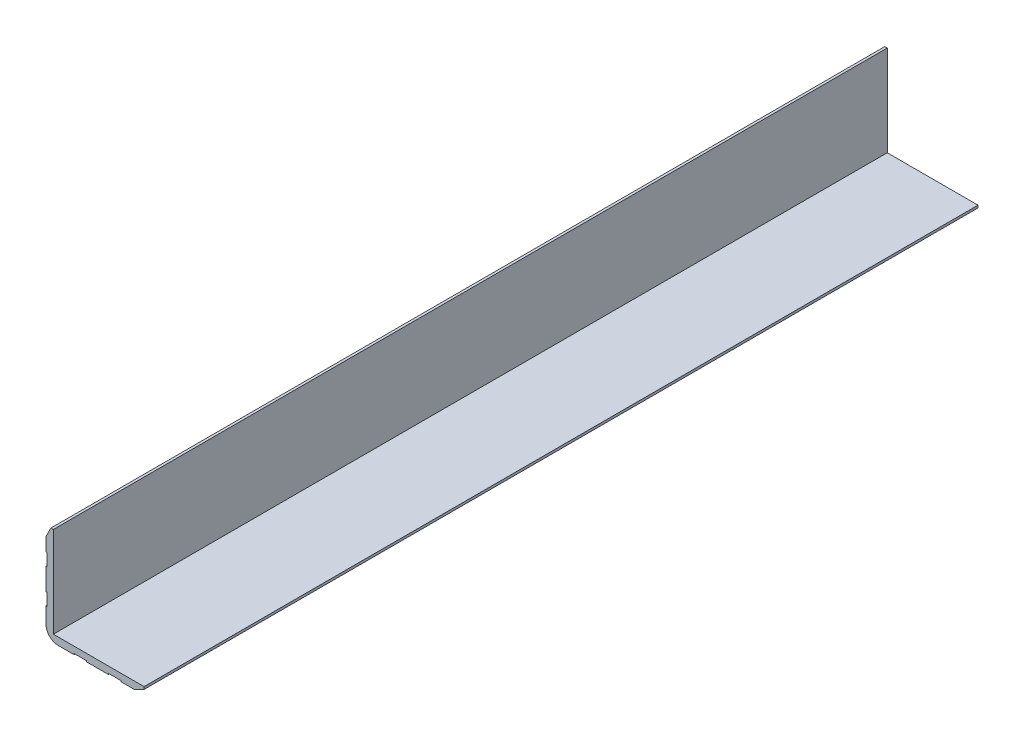
ISO-10303-21;
HEADER;
FILE_DESCRIPTION(('STEP AP214'),'2;1');
FILE_NAME('part.step','',(''),(''),'','','');
FILE_SCHEMA(('AUTOMOTIVE_DESIGN { 1 0 10303 214 1 1 1 1 }'));
ENDSEC;
DATA;
#1=APPLICATION_CONTEXT('core data for automotive mechanical design processes');
#2=APPLICATION_PROTOCOL_DEFINITION('international standard','automotive_design',2000,#1);
#3=PRODUCT_CONTEXT('',#1,'mechanical');
#4=PRODUCT('Part','Part','',(#3));
#5=PRODUCT_RELATED_PRODUCT_CATEGORY('part','',(#4));
#6=PRODUCT_DEFINITION_FORMATION('','',#4);
#7=PRODUCT_DEFINITION_CONTEXT('part definition',#1,'design');
#8=PRODUCT_DEFINITION('design','',#6,#7);
#9=PRODUCT_DEFINITION_SHAPE('','',#8);
#10=(LENGTH_UNIT() NAMED_UNIT(*) SI_UNIT(.MILLI.,.METRE.));
#11=(NAMED_UNIT(*) PLANE_ANGLE_UNIT() SI_UNIT($,.RADIAN.));
#12=(NAMED_UNIT(*) SI_UNIT($,.STERADIAN.) SOLID_ANGLE_UNIT());
#13=UNCERTAINTY_MEASURE_WITH_UNIT(LENGTH_MEASURE(1.E-05),#10,'distance_accuracy_value','');
#14=(GEOMETRIC_REPRESENTATION_CONTEXT(3) GLOBAL_UNCERTAINTY_ASSIGNED_CONTEXT((#13)) GLOBAL_UNIT_ASSIGNED_CONTEXT((#10,
#11,#12)) REPRESENTATION_CONTEXT('',''));
#15=CARTESIAN_POINT('',(0.,0.,0.));
#16=DIRECTION('',(0.,0.,1.));
#17=DIRECTION('',(1.,0.,0.));
#18=AXIS2_PLACEMENT_3D('',#15,#16,#17);
#19=CARTESIAN_POINT('',(18.5,0.,170.));
#20=DIRECTION('',(0.,-1.,0.));
#21=DIRECTION('',(1.,0.,0.));
#22=AXIS2_PLACEMENT_3D('',#19,#20,#21);
#23=PLANE('',#22);
#24=DIRECTION('',(-1.,0.,0.));
#25=VECTOR('',#24,1.);
#26=CARTESIAN_POINT('',(18.5,0.,0.));
#27=LINE('',#26,#25);
#28=CARTESIAN_POINT('',(18.5,0.,0.));
#29=VERTEX_POINT('',#28);
#30=CARTESIAN_POINT('',(0.,0.,0.));
#31=VERTEX_POINT('',#30);
#32=EDGE_CURVE('E246',#29,#31,#27,.T.);
#33=ORIENTED_EDGE('',*,*,#32,.T.);
#34=DIRECTION('',(0.,0.,-1.));
#35=VECTOR('',#34,1.);
#36=CARTESIAN_POINT('',(0.,0.,170.));
#37=LINE('',#36,#35);
#38=CARTESIAN_POINT('',(0.,0.,170.));
#39=VERTEX_POINT('',#38);
#40=EDGE_CURVE('E11',#39,#31,#37,.T.);
#41=ORIENTED_EDGE('',*,*,#40,.F.);
#42=DIRECTION('',(-1.,0.,0.));
#43=VECTOR('',#42,1.);
#44=CARTESIAN_POINT('',(18.5,0.,170.));
#45=LINE('',#44,#43);
#46=CARTESIAN_POINT('',(18.5,0.,170.));
#47=VERTEX_POINT('',#46);
#48=EDGE_CURVE('E319',#47,#39,#45,.T.);
#49=ORIENTED_EDGE('',*,*,#48,.F.);
#50=DIRECTION('',(0.,0.,-1.));
#51=VECTOR('',#50,1.);
#52=CARTESIAN_POINT('',(18.5,0.,170.));
#53=LINE('',#52,#51);
#54=EDGE_CURVE('E242',#47,#29,#53,.T.);
#55=ORIENTED_EDGE('',*,*,#54,.T.);
#56=EDGE_LOOP('',(#33,#41,#49,#55));
#57=FACE_BOUND('',#56,.T.);
#58=ADVANCED_FACE('F43',(#57),#23,.F.);
#59=CARTESIAN_POINT('',(0.,0.,170.));
#60=DIRECTION('',(-1.,0.,0.));
#61=DIRECTION('',(0.,0.,1.));
#62=AXIS2_PLACEMENT_3D('',#59,#60,#61);
#63=PLANE('',#62);
#64=DIRECTION('',(0.,1.,0.));
#65=VECTOR('',#64,1.);
#66=CARTESIAN_POINT('',(0.,0.,0.));
#67=LINE('',#66,#65);
#68=CARTESIAN_POINT('',(0.,18.5,0.));
#69=VERTEX_POINT('',#68);
#70=EDGE_CURVE('E250',#31,#69,#67,.T.);
#71=ORIENTED_EDGE('',*,*,#70,.T.);
#72=DIRECTION('',(0.,0.,-1.));
#73=VECTOR('',#72,1.);
#74=CARTESIAN_POINT('',(0.,18.5,170.));
#75=LINE('',#74,#73);
#76=CARTESIAN_POINT('',(0.,18.5,170.));
#77=VERTEX_POINT('',#76);
#78=EDGE_CURVE('E52',#77,#69,#75,.T.);
#79=ORIENTED_EDGE('',*,*,#78,.F.);
#80=DIRECTION('',(0.,1.,0.));
#81=VECTOR('',#80,1.);
#82=CARTESIAN_POINT('',(0.,0.,170.));
#83=LINE('',#82,#81);
#84=EDGE_CURVE('E154',#39,#77,#83,.T.);
#85=ORIENTED_EDGE('',*,*,#84,.F.);
#86=ORIENTED_EDGE('',*,*,#40,.T.);
#87=EDGE_LOOP('',(#71,#79,#85,#86));
#88=FACE_BOUND('',#87,.T.);
#89=ADVANCED_FACE('F504',(#88),#63,.F.);
#90=CARTESIAN_POINT('',(0.,18.5,170.));
#91=DIRECTION('',(0.,-1.,0.));
#92=DIRECTION('',(0.,0.,-1.));
#93=AXIS2_PLACEMENT_3D('',#90,#91,#92);
#94=PLANE('',#93);
#95=DIRECTION('',(-1.,0.,0.));
#96=VECTOR('',#95,1.);
#97=CARTESIAN_POINT('',(0.,18.5,0.));
#98=LINE('',#97,#96);
#99=CARTESIAN_POINT('',(-0.5,18.5,0.));
#100=VERTEX_POINT('',#99);
#101=EDGE_CURVE('E253',#69,#100,#98,.T.);
#102=ORIENTED_EDGE('',*,*,#101,.T.);
#103=DIRECTION('',(0.,0.,-1.));
#104=VECTOR('',#103,1.);
#105=CARTESIAN_POINT('',(-0.5,18.5,170.));
#106=LINE('',#105,#104);
#107=CARTESIAN_POINT('',(-0.5,18.5,170.));
#108=VERTEX_POINT('',#107);
#109=EDGE_CURVE('E398',#108,#100,#106,.T.);
#110=ORIENTED_EDGE('',*,*,#109,.F.);
#111=DIRECTION('',(-1.,0.,0.));
#112=VECTOR('',#111,1.);
#113=CARTESIAN_POINT('',(0.,18.5,170.));
#114=LINE('',#113,#112);
#115=EDGE_CURVE('E408',#77,#108,#114,.T.);
#116=ORIENTED_EDGE('',*,*,#115,.F.);
#117=ORIENTED_EDGE('',*,*,#78,.T.);
#118=EDGE_LOOP('',(#102,#110,#116,#117));
#119=FACE_BOUND('',#118,.T.);
#120=ADVANCED_FACE('F406',(#119),#94,.F.);
#121=CARTESIAN_POINT('',(-0.5,18.5,170.));
#122=DIRECTION('',(0.894427190999916,-0.447213595499958,0.));
#123=DIRECTION('',(0.447213595499958,0.894427190999916,0.));
#124=AXIS2_PLACEMENT_3D('',#121,#122,#123);
#125=PLANE('',#124);
#126=DIRECTION('',(-0.447213595499958,-0.894427190999916,0.));
#127=VECTOR('',#126,1.);
#128=CARTESIAN_POINT('',(-0.5,18.5,0.));
#129=LINE('',#128,#127);
#130=CARTESIAN_POINT('',(-1.5,16.5,0.));
#131=VERTEX_POINT('',#130);
#132=EDGE_CURVE('E256',#100,#131,#129,.T.);
#133=ORIENTED_EDGE('',*,*,#132,.T.);
#134=DIRECTION('',(0.,0.,-1.));
#135=VECTOR('',#134,1.);
#136=CARTESIAN_POINT('',(-1.5,16.5,170.));
#137=LINE('',#136,#135);
#138=CARTESIAN_POINT('',(-1.5,16.5,170.));
#139=VERTEX_POINT('',#138);
#140=EDGE_CURVE('E394',#139,#131,#137,.T.);
#141=ORIENTED_EDGE('',*,*,#140,.F.);
#142=DIRECTION('',(-0.447213595499958,-0.894427190999916,0.));
#143=VECTOR('',#142,1.);
#144=CARTESIAN_POINT('',(-0.5,18.5,170.));
#145=LINE('',#144,#143);
#146=EDGE_CURVE('E427',#108,#139,#145,.T.);
#147=ORIENTED_EDGE('',*,*,#146,.F.);
#148=ORIENTED_EDGE('',*,*,#109,.T.);
#149=EDGE_LOOP('',(#133,#141,#147,#148));
#150=FACE_BOUND('',#149,.T.);
#151=ADVANCED_FACE('F417',(#150),#125,.F.);
#152=CARTESIAN_POINT('',(-1.5,16.5,170.));
#153=DIRECTION('',(1.,0.,0.));
#154=DIRECTION('',(0.,1.,0.));
#155=AXIS2_PLACEMENT_3D('',#152,#153,#154);
#156=PLANE('',#155);
#157=DIRECTION('',(0.,-1.,0.));
#158=VECTOR('',#157,1.);
#159=CARTESIAN_POINT('',(-1.5,16.5,0.));
#160=LINE('',#159,#158);
#161=CARTESIAN_POINT('',(-1.5,13.75,0.));
#162=VERTEX_POINT('',#161);
#163=EDGE_CURVE('E259',#131,#162,#160,.T.);
#164=ORIENTED_EDGE('',*,*,#163,.T.);
#165=DIRECTION('',(0.,0.,-1.));
#166=VECTOR('',#165,1.);
#167=CARTESIAN_POINT('',(-1.5,13.75,170.));
#168=LINE('',#167,#166);
#169=CARTESIAN_POINT('',(-1.5,13.75,170.));
#170=VERTEX_POINT('',#169);
#171=EDGE_CURVE('E390',#170,#162,#168,.T.);
#172=ORIENTED_EDGE('',*,*,#171,.F.);
#173=DIRECTION('',(0.,-1.,0.));
#174=VECTOR('',#173,1.);
#175=CARTESIAN_POINT('',(-1.5,16.5,170.));
#176=LINE('',#175,#174);
#177=EDGE_CURVE('E423',#139,#170,#176,.T.);
#178=ORIENTED_EDGE('',*,*,#177,.F.);
#179=ORIENTED_EDGE('',*,*,#140,.T.);
#180=EDGE_LOOP('',(#164,#172,#178,#179));
#181=FACE_BOUND('',#180,.T.);
#182=ADVANCED_FACE('F421',(#181),#156,.F.);
#183=CARTESIAN_POINT('',(-1.5,13.75,170.));
#184=DIRECTION('',(0.,1.,0.));
#185=DIRECTION('',(0.,0.,1.));
#186=AXIS2_PLACEMENT_3D('',#183,#184,#185);
#187=PLANE('',#186);
#188=DIRECTION('',(1.,0.,0.));
#189=VECTOR('',#188,1.);
#190=CARTESIAN_POINT('',(-1.5,13.75,0.));
#191=LINE('',#190,#189);
#192=CARTESIAN_POINT('',(-1.3,13.75,0.));
#193=VERTEX_POINT('',#192);
#194=EDGE_CURVE('E262',#162,#193,#191,.T.);
#195=ORIENTED_EDGE('',*,*,#194,.T.);
#196=DIRECTION('',(0.,0.,-1.));
#197=VECTOR('',#196,1.);
#198=CARTESIAN_POINT('',(-1.3,13.75,170.));
#199=LINE('',#198,#197);
#200=CARTESIAN_POINT('',(-1.3,13.75,170.));
#201=VERTEX_POINT('',#200);
#202=EDGE_CURVE('E386',#201,#193,#199,.T.);
#203=ORIENTED_EDGE('',*,*,#202,.F.);
#204=DIRECTION('',(1.,0.,0.));
#205=VECTOR('',#204,1.);
#206=CARTESIAN_POINT('',(-1.5,13.75,170.));
#207=LINE('',#206,#205);
#208=EDGE_CURVE('E426',#170,#201,#207,.T.);
#209=ORIENTED_EDGE('',*,*,#208,.F.);
#210=ORIENTED_EDGE('',*,*,#171,.T.);
#211=EDGE_LOOP('',(#195,#203,#209,#210));
#212=FACE_BOUND('',#211,.T.);
#213=ADVANCED_FACE('F517',(#212),#187,.F.);
#214=CARTESIAN_POINT('',(-1.3,13.75,170.));
#215=DIRECTION('',(1.,0.,0.));
#216=DIRECTION('',(0.,0.,-1.));
#217=AXIS2_PLACEMENT_3D('',#214,#215,#216);
#218=PLANE('',#217);
#219=DIRECTION('',(0.,-1.,0.));
#220=VECTOR('',#219,1.);
#221=CARTESIAN_POINT('',(-1.3,13.75,0.));
#222=LINE('',#221,#220);
#223=CARTESIAN_POINT('',(-1.3,11.25,0.));
#224=VERTEX_POINT('',#223);
#225=EDGE_CURVE('E265',#193,#224,#222,.T.);
#226=ORIENTED_EDGE('',*,*,#225,.T.);
#227=DIRECTION('',(0.,0.,-1.));
#228=VECTOR('',#227,1.);
#229=CARTESIAN_POINT('',(-1.3,11.25,170.));
#230=LINE('',#229,#228);
#231=CARTESIAN_POINT('',(-1.3,11.25,170.));
#232=VERTEX_POINT('',#231);
#233=EDGE_CURVE('E382',#232,#224,#230,.T.);
#234=ORIENTED_EDGE('',*,*,#233,.F.);
#235=DIRECTION('',(0.,-1.,0.));
#236=VECTOR('',#235,1.);
#237=CARTESIAN_POINT('',(-1.3,13.75,170.));
#238=LINE('',#237,#236);
#239=EDGE_CURVE('E431',#201,#232,#238,.T.);
#240=ORIENTED_EDGE('',*,*,#239,.F.);
#241=ORIENTED_EDGE('',*,*,#202,.T.);
#242=EDGE_LOOP('',(#226,#234,#240,#241));
#243=FACE_BOUND('',#242,.T.);
#244=ADVANCED_FACE('F520',(#243),#218,.F.);
#245=CARTESIAN_POINT('',(-1.3,11.25,170.));
#246=DIRECTION('',(0.,-1.,0.));
#247=DIRECTION('',(0.,0.,-1.));
#248=AXIS2_PLACEMENT_3D('',#245,#246,#247);
#249=PLANE('',#248);
#250=DIRECTION('',(-1.,0.,0.));
#251=VECTOR('',#250,1.);
#252=CARTESIAN_POINT('',(-1.3,11.25,0.));
#253=LINE('',#252,#251);
#254=CARTESIAN_POINT('',(-1.5,11.25,0.));
#255=VERTEX_POINT('',#254);
#256=EDGE_CURVE('E268',#224,#255,#253,.T.);
#257=ORIENTED_EDGE('',*,*,#256,.T.);
#258=DIRECTION('',(0.,0.,-1.));
#259=VECTOR('',#258,1.);
#260=CARTESIAN_POINT('',(-1.5,11.25,170.));
#261=LINE('',#260,#259);
#262=CARTESIAN_POINT('',(-1.5,11.25,170.));
#263=VERTEX_POINT('',#262);
#264=EDGE_CURVE('E378',#263,#255,#261,.T.);
#265=ORIENTED_EDGE('',*,*,#264,.F.);
#266=DIRECTION('',(-1.,0.,0.));
#267=VECTOR('',#266,1.);
#268=CARTESIAN_POINT('',(-1.3,11.25,170.));
#269=LINE('',#268,#267);
#270=EDGE_CURVE('E438',#232,#263,#269,.T.);
#271=ORIENTED_EDGE('',*,*,#270,.F.);
#272=ORIENTED_EDGE('',*,*,#233,.T.);
#273=EDGE_LOOP('',(#257,#265,#271,#272));
#274=FACE_BOUND('',#273,.T.);
#275=ADVANCED_FACE('F524',(#274),#249,.F.);
#276=CARTESIAN_POINT('',(-1.5,11.25,170.));
#277=DIRECTION('',(1.,0.,0.));
#278=DIRECTION('',(0.,1.,0.));
#279=AXIS2_PLACEMENT_3D('',#276,#277,#278);
#280=PLANE('',#279);
#281=DIRECTION('',(0.,-1.,0.));
#282=VECTOR('',#281,1.);
#283=CARTESIAN_POINT('',(-1.5,11.25,0.));
#284=LINE('',#283,#282);
#285=CARTESIAN_POINT('',(-1.5,6.75000000000001,0.));
#286=VERTEX_POINT('',#285);
#287=EDGE_CURVE('E271',#255,#286,#284,.T.);
#288=ORIENTED_EDGE('',*,*,#287,.T.);
#289=DIRECTION('',(0.,0.,-1.));
#290=VECTOR('',#289,1.);
#291=CARTESIAN_POINT('',(-1.5,6.75000000000001,170.));
#292=LINE('',#291,#290);
#293=CARTESIAN_POINT('',(-1.5,6.75000000000001,170.));
#294=VERTEX_POINT('',#293);
#295=EDGE_CURVE('E374',#294,#286,#292,.T.);
#296=ORIENTED_EDGE('',*,*,#295,.F.);
#297=DIRECTION('',(0.,-1.,0.));
#298=VECTOR('',#297,1.);
#299=CARTESIAN_POINT('',(-1.5,11.25,170.));
#300=LINE('',#299,#298);
#301=EDGE_CURVE('E441',#263,#294,#300,.T.);
#302=ORIENTED_EDGE('',*,*,#301,.F.);
#303=ORIENTED_EDGE('',*,*,#264,.T.);
#304=EDGE_LOOP('',(#288,#296,#302,#303));
#305=FACE_BOUND('',#304,.T.);
#306=ADVANCED_FACE('F528',(#305),#280,.F.);
#307=CARTESIAN_POINT('',(-1.5,6.75000000000001,170.));
#308=DIRECTION('',(0.,1.,0.));
#309=DIRECTION('',(-1.,0.,0.));
#310=AXIS2_PLACEMENT_3D('',#307,#308,#309);
#311=PLANE('',#310);
#312=DIRECTION('',(1.,0.,0.));
#313=VECTOR('',#312,1.);
#314=CARTESIAN_POINT('',(-1.5,6.75000000000001,0.));
#315=LINE('',#314,#313);
#316=CARTESIAN_POINT('',(-1.3,6.75,0.));
#317=VERTEX_POINT('',#316);
#318=EDGE_CURVE('E274',#286,#317,#315,.T.);
#319=ORIENTED_EDGE('',*,*,#318,.T.);
#320=DIRECTION('',(0.,0.,-1.));
#321=VECTOR('',#320,1.);
#322=CARTESIAN_POINT('',(-1.3,6.75,170.));
#323=LINE('',#322,#321);
#324=CARTESIAN_POINT('',(-1.3,6.75,170.));
#325=VERTEX_POINT('',#324);
#326=EDGE_CURVE('E370',#325,#317,#323,.T.);
#327=ORIENTED_EDGE('',*,*,#326,.F.);
#328=DIRECTION('',(1.,0.,0.));
#329=VECTOR('',#328,1.);
#330=CARTESIAN_POINT('',(-1.5,6.75000000000001,170.));
#331=LINE('',#330,#329);
#332=EDGE_CURVE('E444',#294,#325,#331,.T.);
#333=ORIENTED_EDGE('',*,*,#332,.F.);
#334=ORIENTED_EDGE('',*,*,#295,.T.);
#335=EDGE_LOOP('',(#319,#327,#333,#334));
#336=FACE_BOUND('',#335,.T.);
#337=ADVANCED_FACE('F532',(#336),#311,.F.);
#338=CARTESIAN_POINT('',(-1.3,6.75,170.));
#339=DIRECTION('',(1.,0.,0.));
#340=DIRECTION('',(0.,0.,-1.));
#341=AXIS2_PLACEMENT_3D('',#338,#339,#340);
#342=PLANE('',#341);
#343=DIRECTION('',(0.,-1.,0.));
#344=VECTOR('',#343,1.);
#345=CARTESIAN_POINT('',(-1.3,6.75,0.));
#346=LINE('',#345,#344);
#347=CARTESIAN_POINT('',(-1.3,4.25,0.));
#348=VERTEX_POINT('',#347);
#349=EDGE_CURVE('E277',#317,#348,#346,.T.);
#350=ORIENTED_EDGE('',*,*,#349,.T.);
#351=DIRECTION('',(0.,0.,-1.));
#352=VECTOR('',#351,1.);
#353=CARTESIAN_POINT('',(-1.3,4.25,170.));
#354=LINE('',#353,#352);
#355=CARTESIAN_POINT('',(-1.3,4.25,170.));
#356=VERTEX_POINT('',#355);
#357=EDGE_CURVE('E366',#356,#348,#354,.T.);
#358=ORIENTED_EDGE('',*,*,#357,.F.);
#359=DIRECTION('',(0.,-1.,0.));
#360=VECTOR('',#359,1.);
#361=CARTESIAN_POINT('',(-1.3,6.75,170.));
#362=LINE('',#361,#360);
#363=EDGE_CURVE('E447',#325,#356,#362,.T.);
#364=ORIENTED_EDGE('',*,*,#363,.F.);
#365=ORIENTED_EDGE('',*,*,#326,.T.);
#366=EDGE_LOOP('',(#350,#358,#364,#365));
#367=FACE_BOUND('',#366,.T.);
#368=ADVANCED_FACE('F536',(#367),#342,.F.);
#369=CARTESIAN_POINT('',(-1.3,4.25,170.));
#370=DIRECTION('',(0.,-1.,0.));
#371=DIRECTION('',(0.,0.,-1.));
#372=AXIS2_PLACEMENT_3D('',#369,#370,#371);
#373=PLANE('',#372);
#374=DIRECTION('',(-1.,0.,0.));
#375=VECTOR('',#374,1.);
#376=CARTESIAN_POINT('',(-1.3,4.25,0.));
#377=LINE('',#376,#375);
#378=CARTESIAN_POINT('',(-1.5,4.25,0.));
#379=VERTEX_POINT('',#378);
#380=EDGE_CURVE('E280',#348,#379,#377,.T.);
#381=ORIENTED_EDGE('',*,*,#380,.T.);
#382=DIRECTION('',(0.,0.,-1.));
#383=VECTOR('',#382,1.);
#384=CARTESIAN_POINT('',(-1.5,4.25,170.));
#385=LINE('',#384,#383);
#386=CARTESIAN_POINT('',(-1.5,4.25,170.));
#387=VERTEX_POINT('',#386);
#388=EDGE_CURVE('E362',#387,#379,#385,.T.);
#389=ORIENTED_EDGE('',*,*,#388,.F.);
#390=DIRECTION('',(-1.,0.,0.));
#391=VECTOR('',#390,1.);
#392=CARTESIAN_POINT('',(-1.3,4.25,170.));
#393=LINE('',#392,#391);
#394=EDGE_CURVE('E450',#356,#387,#393,.T.);
#395=ORIENTED_EDGE('',*,*,#394,.F.);
#396=ORIENTED_EDGE('',*,*,#357,.T.);
#397=EDGE_LOOP('',(#381,#389,#395,#396));
#398=FACE_BOUND('',#397,.T.);
#399=ADVANCED_FACE('F540',(#398),#373,.F.);
#400=CARTESIAN_POINT('',(-1.5,4.25,170.));
#401=DIRECTION('',(1.,0.,0.));
#402=DIRECTION('',(0.,1.,0.));
#403=AXIS2_PLACEMENT_3D('',#400,#401,#402);
#404=PLANE('',#403);
#405=DIRECTION('',(0.,-1.,0.));
#406=VECTOR('',#405,1.);
#407=CARTESIAN_POINT('',(-1.5,4.25,0.));
#408=LINE('',#407,#406);
#409=CARTESIAN_POINT('',(-1.5,1.00000000000002,0.));
#410=VERTEX_POINT('',#409);
#411=EDGE_CURVE('E283',#379,#410,#408,.T.);
#412=ORIENTED_EDGE('',*,*,#411,.T.);
#413=DIRECTION('',(0.,0.,-1.));
#414=VECTOR('',#413,1.);
#415=CARTESIAN_POINT('',(-1.5,1.00000000000002,170.));
#416=LINE('',#415,#414);
#417=CARTESIAN_POINT('',(-1.5,1.00000000000002,170.));
#418=VERTEX_POINT('',#417);
#419=EDGE_CURVE('E358',#418,#410,#416,.T.);
#420=ORIENTED_EDGE('',*,*,#419,.F.);
#421=DIRECTION('',(0.,-1.,0.));
#422=VECTOR('',#421,1.);
#423=CARTESIAN_POINT('',(-1.5,4.25,170.));
#424=LINE('',#423,#422);
#425=EDGE_CURVE('E453',#387,#418,#424,.T.);
#426=ORIENTED_EDGE('',*,*,#425,.F.);
#427=ORIENTED_EDGE('',*,*,#388,.T.);
#428=EDGE_LOOP('',(#412,#420,#426,#427));
#429=FACE_BOUND('',#428,.T.);
#430=ADVANCED_FACE('F544',(#429),#404,.F.);
#431=CARTESIAN_POINT('',(1.,1.,170.));
#432=DIRECTION('',(0.,0.,-1.));
#433=DIRECTION('',(-1.,0.,0.));
#434=AXIS2_PLACEMENT_3D('',#431,#432,#433);
#435=CYLINDRICAL_SURFACE('',#434,2.5);
#436=CARTESIAN_POINT('',(1.,1.,0.));
#437=DIRECTION('',(0.,0.,1.));
#438=DIRECTION('',(-1.,0.,0.));
#439=AXIS2_PLACEMENT_3D('',#436,#437,#438);
#440=CIRCLE('',#439,2.5);
#441=CARTESIAN_POINT('',(1.00000000000002,-1.5,0.));
#442=VERTEX_POINT('',#441);
#443=EDGE_CURVE('E286',#410,#442,#440,.T.);
#444=ORIENTED_EDGE('',*,*,#443,.T.);
#445=DIRECTION('',(0.,0.,-1.));
#446=VECTOR('',#445,1.);
#447=CARTESIAN_POINT('',(1.00000000000002,-1.5,170.));
#448=LINE('',#447,#446);
#449=CARTESIAN_POINT('',(1.00000000000002,-1.5,170.));
#450=VERTEX_POINT('',#449);
#451=EDGE_CURVE('E354',#450,#442,#448,.T.);
#452=ORIENTED_EDGE('',*,*,#451,.F.);
#453=CARTESIAN_POINT('',(1.,1.,170.));
#454=DIRECTION('',(0.,0.,1.));
#455=DIRECTION('',(-1.,0.,0.));
#456=AXIS2_PLACEMENT_3D('',#453,#454,#455);
#457=CIRCLE('',#456,2.5);
#458=EDGE_CURVE('E456',#418,#450,#457,.T.);
#459=ORIENTED_EDGE('',*,*,#458,.F.);
#460=ORIENTED_EDGE('',*,*,#419,.T.);
#461=EDGE_LOOP('',(#444,#452,#459,#460));
#462=FACE_BOUND('',#461,.T.);
#463=ADVANCED_FACE('F548',(#462),#435,.T.);
#464=CARTESIAN_POINT('',(1.00000000000002,-1.5,170.));
#465=DIRECTION('',(0.,1.,0.));
#466=DIRECTION('',(-1.,0.,0.));
#467=AXIS2_PLACEMENT_3D('',#464,#465,#466);
#468=PLANE('',#467);
#469=DIRECTION('',(1.,0.,0.));
#470=VECTOR('',#469,1.);
#471=CARTESIAN_POINT('',(1.00000000000002,-1.5,0.));
#472=LINE('',#471,#470);
#473=CARTESIAN_POINT('',(4.25,-1.5,0.));
#474=VERTEX_POINT('',#473);
#475=EDGE_CURVE('E289',#442,#474,#472,.T.);
#476=ORIENTED_EDGE('',*,*,#475,.T.);
#477=DIRECTION('',(0.,0.,-1.));
#478=VECTOR('',#477,1.);
#479=CARTESIAN_POINT('',(4.25,-1.5,170.));
#480=LINE('',#479,#478);
#481=CARTESIAN_POINT('',(4.25,-1.5,170.));
#482=VERTEX_POINT('',#481);
#483=EDGE_CURVE('E350',#482,#474,#480,.T.);
#484=ORIENTED_EDGE('',*,*,#483,.F.);
#485=DIRECTION('',(1.,0.,0.));
#486=VECTOR('',#485,1.);
#487=CARTESIAN_POINT('',(1.00000000000002,-1.5,170.));
#488=LINE('',#487,#486);
#489=EDGE_CURVE('E459',#450,#482,#488,.T.);
#490=ORIENTED_EDGE('',*,*,#489,.F.);
#491=ORIENTED_EDGE('',*,*,#451,.T.);
#492=EDGE_LOOP('',(#476,#484,#490,#491));
#493=FACE_BOUND('',#492,.T.);
#494=ADVANCED_FACE('F552',(#493),#468,.F.);
#495=CARTESIAN_POINT('',(4.25,-1.5,170.));
#496=DIRECTION('',(-1.,0.,0.));
#497=DIRECTION('',(0.,0.,1.));
#498=AXIS2_PLACEMENT_3D('',#495,#496,#497);
#499=PLANE('',#498);
#500=DIRECTION('',(0.,1.,0.));
#501=VECTOR('',#500,1.);
#502=CARTESIAN_POINT('',(4.25,-1.5,0.));
#503=LINE('',#502,#501);
#504=CARTESIAN_POINT('',(4.25,-1.29999999999999,0.));
#505=VERTEX_POINT('',#504);
#506=EDGE_CURVE('E292',#474,#505,#503,.T.);
#507=ORIENTED_EDGE('',*,*,#506,.T.);
#508=DIRECTION('',(0.,0.,-1.));
#509=VECTOR('',#508,1.);
#510=CARTESIAN_POINT('',(4.25,-1.29999999999999,170.));
#511=LINE('',#510,#509);
#512=CARTESIAN_POINT('',(4.25,-1.29999999999999,170.));
#513=VERTEX_POINT('',#512);
#514=EDGE_CURVE('E346',#513,#505,#511,.T.);
#515=ORIENTED_EDGE('',*,*,#514,.F.);
#516=DIRECTION('',(0.,1.,0.));
#517=VECTOR('',#516,1.);
#518=CARTESIAN_POINT('',(4.25,-1.5,170.));
#519=LINE('',#518,#517);
#520=EDGE_CURVE('E462',#482,#513,#519,.T.);
#521=ORIENTED_EDGE('',*,*,#520,.F.);
#522=ORIENTED_EDGE('',*,*,#483,.T.);
#523=EDGE_LOOP('',(#507,#515,#521,#522));
#524=FACE_BOUND('',#523,.T.);
#525=ADVANCED_FACE('F556',(#524),#499,.F.);
#526=CARTESIAN_POINT('',(4.25,-1.29999999999999,170.));
#527=DIRECTION('',(0.,1.,0.));
#528=DIRECTION('',(0.,0.,1.));
#529=AXIS2_PLACEMENT_3D('',#526,#527,#528);
#530=PLANE('',#529);
#531=DIRECTION('',(1.,0.,0.));
#532=VECTOR('',#531,1.);
#533=CARTESIAN_POINT('',(4.25,-1.29999999999999,0.));
#534=LINE('',#533,#532);
#535=CARTESIAN_POINT('',(6.75,-1.29999999999999,0.));
#536=VERTEX_POINT('',#535);
#537=EDGE_CURVE('E295',#505,#536,#534,.T.);
#538=ORIENTED_EDGE('',*,*,#537,.T.);
#539=DIRECTION('',(0.,0.,-1.));
#540=VECTOR('',#539,1.);
#541=CARTESIAN_POINT('',(6.75,-1.29999999999999,170.));
#542=LINE('',#541,#540);
#543=CARTESIAN_POINT('',(6.75,-1.29999999999999,170.));
#544=VERTEX_POINT('',#543);
#545=EDGE_CURVE('E342',#544,#536,#542,.T.);
#546=ORIENTED_EDGE('',*,*,#545,.F.);
#547=DIRECTION('',(1.,0.,0.));
#548=VECTOR('',#547,1.);
#549=CARTESIAN_POINT('',(4.25,-1.29999999999999,170.));
#550=LINE('',#549,#548);
#551=EDGE_CURVE('E465',#513,#544,#550,.T.);
#552=ORIENTED_EDGE('',*,*,#551,.F.);
#553=ORIENTED_EDGE('',*,*,#514,.T.);
#554=EDGE_LOOP('',(#538,#546,#552,#553));
#555=FACE_BOUND('',#554,.T.);
#556=ADVANCED_FACE('F560',(#555),#530,.F.);
#557=CARTESIAN_POINT('',(6.75,-1.29999999999999,170.));
#558=DIRECTION('',(1.,0.,0.));
#559=DIRECTION('',(0.,0.,-1.));
#560=AXIS2_PLACEMENT_3D('',#557,#558,#559);
#561=PLANE('',#560);
#562=DIRECTION('',(0.,-1.,0.));
#563=VECTOR('',#562,1.);
#564=CARTESIAN_POINT('',(6.75,-1.29999999999999,0.));
#565=LINE('',#564,#563);
#566=CARTESIAN_POINT('',(6.75,-1.49999999999999,0.));
#567=VERTEX_POINT('',#566);
#568=EDGE_CURVE('E298',#536,#567,#565,.T.);
#569=ORIENTED_EDGE('',*,*,#568,.T.);
#570=DIRECTION('',(0.,0.,-1.));
#571=VECTOR('',#570,1.);
#572=CARTESIAN_POINT('',(6.75,-1.49999999999999,170.));
#573=LINE('',#572,#571);
#574=CARTESIAN_POINT('',(6.75,-1.49999999999999,170.));
#575=VERTEX_POINT('',#574);
#576=EDGE_CURVE('E338',#575,#567,#573,.T.);
#577=ORIENTED_EDGE('',*,*,#576,.F.);
#578=DIRECTION('',(0.,-1.,0.));
#579=VECTOR('',#578,1.);
#580=CARTESIAN_POINT('',(6.75,-1.29999999999999,170.));
#581=LINE('',#580,#579);
#582=EDGE_CURVE('E468',#544,#575,#581,.T.);
#583=ORIENTED_EDGE('',*,*,#582,.F.);
#584=ORIENTED_EDGE('',*,*,#545,.T.);
#585=EDGE_LOOP('',(#569,#577,#583,#584));
#586=FACE_BOUND('',#585,.T.);
#587=ADVANCED_FACE('F564',(#586),#561,.F.);
#588=CARTESIAN_POINT('',(6.75,-1.49999999999999,170.));
#589=DIRECTION('',(0.,1.,0.));
#590=DIRECTION('',(0.,0.,1.));
#591=AXIS2_PLACEMENT_3D('',#588,#589,#590);
#592=PLANE('',#591);
#593=DIRECTION('',(1.,0.,0.));
#594=VECTOR('',#593,1.);
#595=CARTESIAN_POINT('',(6.75,-1.49999999999999,0.));
#596=LINE('',#595,#594);
#597=CARTESIAN_POINT('',(11.25,-1.49999999999999,0.));
#598=VERTEX_POINT('',#597);
#599=EDGE_CURVE('E301',#567,#598,#596,.T.);
#600=ORIENTED_EDGE('',*,*,#599,.T.);
#601=DIRECTION('',(0.,0.,-1.));
#602=VECTOR('',#601,1.);
#603=CARTESIAN_POINT('',(11.25,-1.49999999999999,170.));
#604=LINE('',#603,#602);
#605=CARTESIAN_POINT('',(11.25,-1.49999999999999,170.));
#606=VERTEX_POINT('',#605);
#607=EDGE_CURVE('E334',#606,#598,#604,.T.);
#608=ORIENTED_EDGE('',*,*,#607,.F.);
#609=DIRECTION('',(1.,0.,0.));
#610=VECTOR('',#609,1.);
#611=CARTESIAN_POINT('',(6.75,-1.49999999999999,170.));
#612=LINE('',#611,#610);
#613=EDGE_CURVE('E471',#575,#606,#612,.T.);
#614=ORIENTED_EDGE('',*,*,#613,.F.);
#615=ORIENTED_EDGE('',*,*,#576,.T.);
#616=EDGE_LOOP('',(#600,#608,#614,#615));
#617=FACE_BOUND('',#616,.T.);
#618=ADVANCED_FACE('F568',(#617),#592,.F.);
#619=CARTESIAN_POINT('',(11.25,-1.49999999999999,170.));
#620=DIRECTION('',(-1.,0.,0.));
#621=DIRECTION('',(0.,0.,1.));
#622=AXIS2_PLACEMENT_3D('',#619,#620,#621);
#623=PLANE('',#622);
#624=DIRECTION('',(0.,1.,0.));
#625=VECTOR('',#624,1.);
#626=CARTESIAN_POINT('',(11.25,-1.49999999999999,0.));
#627=LINE('',#626,#625);
#628=CARTESIAN_POINT('',(11.25,-1.29999999999999,0.));
#629=VERTEX_POINT('',#628);
#630=EDGE_CURVE('E304',#598,#629,#627,.T.);
#631=ORIENTED_EDGE('',*,*,#630,.T.);
#632=DIRECTION('',(0.,0.,-1.));
#633=VECTOR('',#632,1.);
#634=CARTESIAN_POINT('',(11.25,-1.29999999999999,170.));
#635=LINE('',#634,#633);
#636=CARTESIAN_POINT('',(11.25,-1.29999999999999,170.));
#637=VERTEX_POINT('',#636);
#638=EDGE_CURVE('E330',#637,#629,#635,.T.);
#639=ORIENTED_EDGE('',*,*,#638,.F.);
#640=DIRECTION('',(0.,1.,0.));
#641=VECTOR('',#640,1.);
#642=CARTESIAN_POINT('',(11.25,-1.49999999999999,170.));
#643=LINE('',#642,#641);
#644=EDGE_CURVE('E474',#606,#637,#643,.T.);
#645=ORIENTED_EDGE('',*,*,#644,.F.);
#646=ORIENTED_EDGE('',*,*,#607,.T.);
#647=EDGE_LOOP('',(#631,#639,#645,#646));
#648=FACE_BOUND('',#647,.T.);
#649=ADVANCED_FACE('F572',(#648),#623,.F.);
#650=CARTESIAN_POINT('',(11.25,-1.29999999999999,170.));
#651=DIRECTION('',(0.,1.,0.));
#652=DIRECTION('',(0.,0.,1.));
#653=AXIS2_PLACEMENT_3D('',#650,#651,#652);
#654=PLANE('',#653);
#655=DIRECTION('',(1.,0.,0.));
#656=VECTOR('',#655,1.);
#657=CARTESIAN_POINT('',(11.25,-1.29999999999999,0.));
#658=LINE('',#657,#656);
#659=CARTESIAN_POINT('',(13.75,-1.29999999999999,0.));
#660=VERTEX_POINT('',#659);
#661=EDGE_CURVE('E307',#629,#660,#658,.T.);
#662=ORIENTED_EDGE('',*,*,#661,.T.);
#663=DIRECTION('',(0.,0.,-1.));
#664=VECTOR('',#663,1.);
#665=CARTESIAN_POINT('',(13.75,-1.29999999999999,170.));
#666=LINE('',#665,#664);
#667=CARTESIAN_POINT('',(13.75,-1.29999999999999,170.));
#668=VERTEX_POINT('',#667);
#669=EDGE_CURVE('E326',#668,#660,#666,.T.);
#670=ORIENTED_EDGE('',*,*,#669,.F.);
#671=DIRECTION('',(1.,0.,0.));
#672=VECTOR('',#671,1.);
#673=CARTESIAN_POINT('',(11.25,-1.29999999999999,170.));
#674=LINE('',#673,#672);
#675=EDGE_CURVE('E477',#637,#668,#674,.T.);
#676=ORIENTED_EDGE('',*,*,#675,.F.);
#677=ORIENTED_EDGE('',*,*,#638,.T.);
#678=EDGE_LOOP('',(#662,#670,#676,#677));
#679=FACE_BOUND('',#678,.T.);
#680=ADVANCED_FACE('F485',(#679),#654,.F.);
#681=CARTESIAN_POINT('',(13.75,-1.29999999999999,170.));
#682=DIRECTION('',(1.,0.,0.));
#683=DIRECTION('',(0.,0.,-1.));
#684=AXIS2_PLACEMENT_3D('',#681,#682,#683);
#685=PLANE('',#684);
#686=DIRECTION('',(0.,-1.,0.));
#687=VECTOR('',#686,1.);
#688=CARTESIAN_POINT('',(13.75,-1.29999999999999,0.));
#689=LINE('',#688,#687);
#690=CARTESIAN_POINT('',(13.75,-1.49999999999999,0.));
#691=VERTEX_POINT('',#690);
#692=EDGE_CURVE('E310',#660,#691,#689,.T.);
#693=ORIENTED_EDGE('',*,*,#692,.T.);
#694=DIRECTION('',(0.,0.,-1.));
#695=VECTOR('',#694,1.);
#696=CARTESIAN_POINT('',(13.75,-1.49999999999999,170.));
#697=LINE('',#696,#695);
#698=CARTESIAN_POINT('',(13.75,-1.49999999999999,170.));
#699=VERTEX_POINT('',#698);
#700=EDGE_CURVE('E235',#699,#691,#697,.T.);
#701=ORIENTED_EDGE('',*,*,#700,.F.);
#702=DIRECTION('',(0.,-1.,0.));
#703=VECTOR('',#702,1.);
#704=CARTESIAN_POINT('',(13.75,-1.29999999999999,170.));
#705=LINE('',#704,#703);
#706=EDGE_CURVE('E224',#668,#699,#705,.T.);
#707=ORIENTED_EDGE('',*,*,#706,.F.);
#708=ORIENTED_EDGE('',*,*,#669,.T.);
#709=EDGE_LOOP('',(#693,#701,#707,#708));
#710=FACE_BOUND('',#709,.T.);
#711=ADVANCED_FACE('F489',(#710),#685,.F.);
#712=CARTESIAN_POINT('',(13.75,-1.49999999999999,170.));
#713=DIRECTION('',(0.,1.,0.));
#714=DIRECTION('',(-1.,0.,0.));
#715=AXIS2_PLACEMENT_3D('',#712,#713,#714);
#716=PLANE('',#715);
#717=DIRECTION('',(1.,0.,0.));
#718=VECTOR('',#717,1.);
#719=CARTESIAN_POINT('',(13.75,-1.49999999999999,0.));
#720=LINE('',#719,#718);
#721=CARTESIAN_POINT('',(16.5,-1.5,0.));
#722=VERTEX_POINT('',#721);
#723=EDGE_CURVE('E233',#691,#722,#720,.T.);
#724=ORIENTED_EDGE('',*,*,#723,.T.);
#725=DIRECTION('',(0.,0.,-1.));
#726=VECTOR('',#725,1.);
#727=CARTESIAN_POINT('',(16.5,-1.5,170.));
#728=LINE('',#727,#726);
#729=CARTESIAN_POINT('',(16.5,-1.5,170.));
#730=VERTEX_POINT('',#729);
#731=EDGE_CURVE('E230',#730,#722,#728,.T.);
#732=ORIENTED_EDGE('',*,*,#731,.F.);
#733=DIRECTION('',(1.,0.,0.));
#734=VECTOR('',#733,1.);
#735=CARTESIAN_POINT('',(13.75,-1.49999999999999,170.));
#736=LINE('',#735,#734);
#737=EDGE_CURVE('E218',#699,#730,#736,.T.);
#738=ORIENTED_EDGE('',*,*,#737,.F.);
#739=ORIENTED_EDGE('',*,*,#700,.T.);
#740=EDGE_LOOP('',(#724,#732,#738,#739));
#741=FACE_BOUND('',#740,.T.);
#742=ADVANCED_FACE('F231',(#741),#716,.F.);
#743=CARTESIAN_POINT('',(16.5,-1.5,170.));
#744=DIRECTION('',(-0.447213595499956,0.894427190999917,0.));
#745=DIRECTION('',(-0.894427190999917,-0.447213595499956,0.));
#746=AXIS2_PLACEMENT_3D('',#743,#744,#745);
#747=PLANE('',#746);
#748=DIRECTION('',(0.894427190999917,0.447213595499956,0.));
#749=VECTOR('',#748,1.);
#750=CARTESIAN_POINT('',(16.5,-1.5,0.));
#751=LINE('',#750,#749);
#752=CARTESIAN_POINT('',(18.5,-0.500000000000002,0.));
#753=VERTEX_POINT('',#752);
#754=EDGE_CURVE('E140',#722,#753,#751,.T.);
#755=ORIENTED_EDGE('',*,*,#754,.T.);
#756=DIRECTION('',(0.,0.,-1.));
#757=VECTOR('',#756,1.);
#758=CARTESIAN_POINT('',(18.5,-0.500000000000002,170.));
#759=LINE('',#758,#757);
#760=CARTESIAN_POINT('',(18.5,-0.500000000000002,170.));
#761=VERTEX_POINT('',#760);
#762=EDGE_CURVE('E236',#761,#753,#759,.T.);
#763=ORIENTED_EDGE('',*,*,#762,.F.);
#764=DIRECTION('',(0.894427190999917,0.447213595499956,0.));
#765=VECTOR('',#764,1.);
#766=CARTESIAN_POINT('',(16.5,-1.5,170.));
#767=LINE('',#766,#765);
#768=EDGE_CURVE('E222',#730,#761,#767,.T.);
#769=ORIENTED_EDGE('',*,*,#768,.F.);
#770=ORIENTED_EDGE('',*,*,#731,.T.);
#771=EDGE_LOOP('',(#755,#763,#769,#770));
#772=FACE_BOUND('',#771,.T.);
#773=ADVANCED_FACE('F238',(#772),#747,.F.);
#774=CARTESIAN_POINT('',(18.5,-0.500000000000002,170.));
#775=DIRECTION('',(-1.,0.,0.));
#776=DIRECTION('',(0.,0.,1.));
#777=AXIS2_PLACEMENT_3D('',#774,#775,#776);
#778=PLANE('',#777);
#779=DIRECTION('',(0.,1.,0.));
#780=VECTOR('',#779,1.);
#781=CARTESIAN_POINT('',(18.5,-0.500000000000002,0.));
#782=LINE('',#781,#780);
#783=EDGE_CURVE('E146',#753,#29,#782,.T.);
#784=ORIENTED_EDGE('',*,*,#783,.T.);
#785=ORIENTED_EDGE('',*,*,#54,.F.);
#786=DIRECTION('',(0.,1.,0.));
#787=VECTOR('',#786,1.);
#788=CARTESIAN_POINT('',(18.5,-0.500000000000002,170.));
#789=LINE('',#788,#787);
#790=EDGE_CURVE('E60',#761,#47,#789,.T.);
#791=ORIENTED_EDGE('',*,*,#790,.F.);
#792=ORIENTED_EDGE('',*,*,#762,.T.);
#793=EDGE_LOOP('',(#784,#785,#791,#792));
#794=FACE_BOUND('',#793,.T.);
#795=ADVANCED_FACE('F493',(#794),#778,.F.);
#796=CARTESIAN_POINT('',(1.,1.,170.));
#797=DIRECTION('',(0.,0.,-1.));
#798=DIRECTION('',(-1.,0.,0.));
#799=AXIS2_PLACEMENT_3D('',#796,#797,#798);
#800=PLANE('',#799);
#801=ORIENTED_EDGE('',*,*,#48,.T.);
#802=ORIENTED_EDGE('',*,*,#84,.T.);
#803=ORIENTED_EDGE('',*,*,#115,.T.);
#804=ORIENTED_EDGE('',*,*,#146,.T.);
#805=ORIENTED_EDGE('',*,*,#177,.T.);
#806=ORIENTED_EDGE('',*,*,#208,.T.);
#807=ORIENTED_EDGE('',*,*,#239,.T.);
#808=ORIENTED_EDGE('',*,*,#270,.T.);
#809=ORIENTED_EDGE('',*,*,#301,.T.);
#810=ORIENTED_EDGE('',*,*,#332,.T.);
#811=ORIENTED_EDGE('',*,*,#363,.T.);
#812=ORIENTED_EDGE('',*,*,#394,.T.);
#813=ORIENTED_EDGE('',*,*,#425,.T.);
#814=ORIENTED_EDGE('',*,*,#458,.T.);
#815=ORIENTED_EDGE('',*,*,#489,.T.);
#816=ORIENTED_EDGE('',*,*,#520,.T.);
#817=ORIENTED_EDGE('',*,*,#551,.T.);
#818=ORIENTED_EDGE('',*,*,#582,.T.);
#819=ORIENTED_EDGE('',*,*,#613,.T.);
#820=ORIENTED_EDGE('',*,*,#644,.T.);
#821=ORIENTED_EDGE('',*,*,#675,.T.);
#822=ORIENTED_EDGE('',*,*,#706,.T.);
#823=ORIENTED_EDGE('',*,*,#737,.T.);
#824=ORIENTED_EDGE('',*,*,#768,.T.);
#825=ORIENTED_EDGE('',*,*,#790,.T.);
#826=EDGE_LOOP('',(#801,#802,#803,#804,#805,#806,#807,#808,#809,#810,#811,#812,#813,#814,#815,
#816,#817,#818,#819,#820,#821,#822,#823,#824,#825));
#827=FACE_BOUND('',#826,.T.);
#828=ADVANCED_FACE('F220',(#827),#800,.F.);
#829=CARTESIAN_POINT('',(1.,1.,0.));
#830=DIRECTION('',(0.,0.,-1.));
#831=DIRECTION('',(-1.,0.,0.));
#832=AXIS2_PLACEMENT_3D('',#829,#830,#831);
#833=PLANE('',#832);
#834=ORIENTED_EDGE('',*,*,#32,.F.);
#835=ORIENTED_EDGE('',*,*,#783,.F.);
#836=ORIENTED_EDGE('',*,*,#754,.F.);
#837=ORIENTED_EDGE('',*,*,#723,.F.);
#838=ORIENTED_EDGE('',*,*,#692,.F.);
#839=ORIENTED_EDGE('',*,*,#661,.F.);
#840=ORIENTED_EDGE('',*,*,#630,.F.);
#841=ORIENTED_EDGE('',*,*,#599,.F.);
#842=ORIENTED_EDGE('',*,*,#568,.F.);
#843=ORIENTED_EDGE('',*,*,#537,.F.);
#844=ORIENTED_EDGE('',*,*,#506,.F.);
#845=ORIENTED_EDGE('',*,*,#475,.F.);
#846=ORIENTED_EDGE('',*,*,#443,.F.);
#847=ORIENTED_EDGE('',*,*,#411,.F.);
#848=ORIENTED_EDGE('',*,*,#380,.F.);
#849=ORIENTED_EDGE('',*,*,#349,.F.);
#850=ORIENTED_EDGE('',*,*,#318,.F.);
#851=ORIENTED_EDGE('',*,*,#287,.F.);
#852=ORIENTED_EDGE('',*,*,#256,.F.);
#853=ORIENTED_EDGE('',*,*,#225,.F.);
#854=ORIENTED_EDGE('',*,*,#194,.F.);
#855=ORIENTED_EDGE('',*,*,#163,.F.);
#856=ORIENTED_EDGE('',*,*,#132,.F.);
#857=ORIENTED_EDGE('',*,*,#101,.F.);
#858=ORIENTED_EDGE('',*,*,#70,.F.);
#859=EDGE_LOOP('',(#834,#835,#836,#837,#838,#839,#840,#841,#842,#843,#844,#845,#846,#847,#848,
#849,#850,#851,#852,#853,#854,#855,#856,#857,#858));
#860=FACE_BOUND('',#859,.T.);
#861=ADVANCED_FACE('F412',(#860),#833,.T.);
#862=CLOSED_SHELL('',(#58,#89,#120,#151,#182,#213,#244,#275,#306,#337,#368,#399,#430,#463,#494,
#525,#556,#587,#618,#649,#680,#711,#742,#773,#795,#828,#861));
#863=MANIFOLD_SOLID_BREP('B2',#862);
#864=ADVANCED_BREP_SHAPE_REPRESENTATION('',(#18,#863),#14);
#865=SHAPE_DEFINITION_REPRESENTATION(#9,#864);
ENDSEC;
END-ISO-10303-21;
